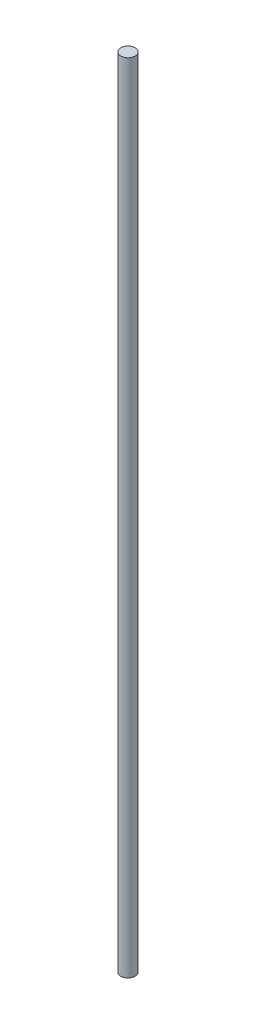
ISO-10303-21;
HEADER;
FILE_DESCRIPTION(('STEP AP214'),'2;1');
FILE_NAME('part.step','',(''),(''),'','','');
FILE_SCHEMA(('AUTOMOTIVE_DESIGN { 1 0 10303 214 1 1 1 1 }'));
ENDSEC;
DATA;
#1=APPLICATION_CONTEXT('core data for automotive mechanical design processes');
#2=APPLICATION_PROTOCOL_DEFINITION('international standard','automotive_design',2000,#1);
#3=PRODUCT_CONTEXT('',#1,'mechanical');
#4=PRODUCT('Part','Part','',(#3));
#5=PRODUCT_RELATED_PRODUCT_CATEGORY('part','',(#4));
#6=PRODUCT_DEFINITION_FORMATION('','',#4);
#7=PRODUCT_DEFINITION_CONTEXT('part definition',#1,'design');
#8=PRODUCT_DEFINITION('design','',#6,#7);
#9=PRODUCT_DEFINITION_SHAPE('','',#8);
#10=(LENGTH_UNIT() NAMED_UNIT(*) SI_UNIT(.MILLI.,.METRE.));
#11=(NAMED_UNIT(*) PLANE_ANGLE_UNIT() SI_UNIT($,.RADIAN.));
#12=(NAMED_UNIT(*) SI_UNIT($,.STERADIAN.) SOLID_ANGLE_UNIT());
#13=UNCERTAINTY_MEASURE_WITH_UNIT(LENGTH_MEASURE(1.E-05),#10,'distance_accuracy_value','');
#14=(GEOMETRIC_REPRESENTATION_CONTEXT(3) GLOBAL_UNCERTAINTY_ASSIGNED_CONTEXT((#13)) GLOBAL_UNIT_ASSIGNED_CONTEXT((#10,
#11,#12)) REPRESENTATION_CONTEXT('',''));
#15=CARTESIAN_POINT('',(0.,0.,0.));
#16=DIRECTION('',(0.,0.,1.));
#17=DIRECTION('',(1.,0.,0.));
#18=AXIS2_PLACEMENT_3D('',#15,#16,#17);
#19=CARTESIAN_POINT('',(0.,221.,0.));
#20=DIRECTION('',(0.,-1.,0.));
#21=DIRECTION('',(0.,0.,-1.));
#22=AXIS2_PLACEMENT_3D('',#19,#20,#21);
#23=CYLINDRICAL_SURFACE('',#22,4.);
#24=CARTESIAN_POINT('',(0.,221.,0.));
#25=DIRECTION('',(0.,1.,0.));
#26=DIRECTION('',(0.,0.,1.));
#27=AXIS2_PLACEMENT_3D('',#24,#25,#26);
#28=CIRCLE('',#27,4.);
#29=CARTESIAN_POINT('',(0.,221.,4.));
#30=VERTEX_POINT('',#29);
#31=EDGE_CURVE('E10',#30,#30,#28,.T.);
#32=ORIENTED_EDGE('',*,*,#31,.F.);
#33=EDGE_LOOP('',(#32));
#34=FACE_BOUND('',#33,.T.);
#35=CARTESIAN_POINT('',(0.,-221.,0.));
#36=DIRECTION('',(0.,1.,0.));
#37=DIRECTION('',(0.,0.,1.));
#38=AXIS2_PLACEMENT_3D('',#35,#36,#37);
#39=CIRCLE('',#38,4.);
#40=CARTESIAN_POINT('',(0.,-221.,4.));
#41=VERTEX_POINT('',#40);
#42=EDGE_CURVE('E34',#41,#41,#39,.T.);
#43=ORIENTED_EDGE('',*,*,#42,.T.);
#44=EDGE_LOOP('',(#43));
#45=FACE_BOUND('',#44,.T.);
#46=ADVANCED_FACE('F31',(#34,#45),#23,.T.);
#47=CARTESIAN_POINT('',(0.,221.,0.));
#48=DIRECTION('',(0.,1.,0.));
#49=DIRECTION('',(0.,0.,1.));
#50=AXIS2_PLACEMENT_3D('',#47,#48,#49);
#51=PLANE('',#50);
#52=ORIENTED_EDGE('',*,*,#31,.T.);
#53=EDGE_LOOP('',(#52));
#54=FACE_BOUND('',#53,.T.);
#55=ADVANCED_FACE('F46',(#54),#51,.T.);
#56=CARTESIAN_POINT('',(0.,-221.,0.));
#57=DIRECTION('',(0.,1.,0.));
#58=DIRECTION('',(0.,0.,1.));
#59=AXIS2_PLACEMENT_3D('',#56,#57,#58);
#60=PLANE('',#59);
#61=ORIENTED_EDGE('',*,*,#42,.F.);
#62=EDGE_LOOP('',(#61));
#63=FACE_BOUND('',#62,.T.);
#64=ADVANCED_FACE('F44',(#63),#60,.F.);
#65=CLOSED_SHELL('',(#46,#55,#64));
#66=MANIFOLD_SOLID_BREP('B2',#65);
#67=ADVANCED_BREP_SHAPE_REPRESENTATION('',(#18,#66),#14);
#68=SHAPE_DEFINITION_REPRESENTATION(#9,#67);
ENDSEC;
END-ISO-10303-21;
